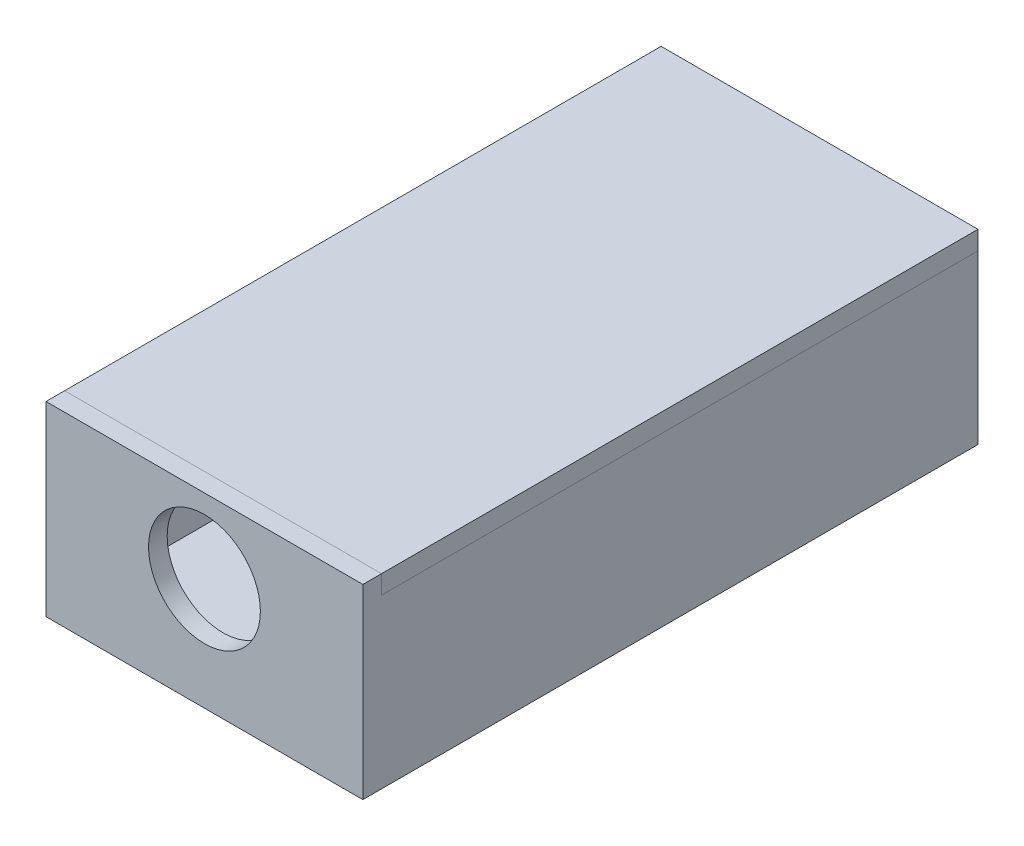
ISO-10303-21;
HEADER;
FILE_DESCRIPTION(('STEP AP214'),'2;1');
FILE_NAME('part.step','',(''),(''),'','','');
FILE_SCHEMA(('AUTOMOTIVE_DESIGN { 1 0 10303 214 1 1 1 1 }'));
ENDSEC;
DATA;
#1=APPLICATION_CONTEXT('core data for automotive mechanical design processes');
#2=APPLICATION_PROTOCOL_DEFINITION('international standard','automotive_design',2000,#1);
#3=PRODUCT_CONTEXT('',#1,'mechanical');
#4=PRODUCT('Part','Part','',(#3));
#5=PRODUCT_RELATED_PRODUCT_CATEGORY('part','',(#4));
#6=PRODUCT_DEFINITION_FORMATION('','',#4);
#7=PRODUCT_DEFINITION_CONTEXT('part definition',#1,'design');
#8=PRODUCT_DEFINITION('design','',#6,#7);
#9=PRODUCT_DEFINITION_SHAPE('','',#8);
#10=(LENGTH_UNIT() NAMED_UNIT(*) SI_UNIT(.MILLI.,.METRE.));
#11=(NAMED_UNIT(*) PLANE_ANGLE_UNIT() SI_UNIT($,.RADIAN.));
#12=(NAMED_UNIT(*) SI_UNIT($,.STERADIAN.) SOLID_ANGLE_UNIT());
#13=UNCERTAINTY_MEASURE_WITH_UNIT(LENGTH_MEASURE(1.E-05),#10,'distance_accuracy_value','');
#14=(GEOMETRIC_REPRESENTATION_CONTEXT(3) GLOBAL_UNCERTAINTY_ASSIGNED_CONTEXT((#13)) GLOBAL_UNIT_ASSIGNED_CONTEXT((#10,
#11,#12)) REPRESENTATION_CONTEXT('',''));
#15=CARTESIAN_POINT('',(0.,0.,0.));
#16=DIRECTION('',(0.,0.,1.));
#17=DIRECTION('',(1.,0.,0.));
#18=AXIS2_PLACEMENT_3D('',#15,#16,#17);
#19=CARTESIAN_POINT('',(-8.49999999999999,10.,-16.5));
#20=DIRECTION('',(1.,0.,0.));
#21=DIRECTION('',(0.,0.,-1.));
#22=AXIS2_PLACEMENT_3D('',#19,#20,#21);
#23=PLANE('',#22);
#24=DIRECTION('',(0.,0.,1.));
#25=VECTOR('',#24,1.);
#26=CARTESIAN_POINT('',(-8.49999999999999,9.,-16.5));
#27=LINE('',#26,#25);
#28=CARTESIAN_POINT('',(-8.49999999999999,9.,-16.5));
#29=VERTEX_POINT('',#28);
#30=CARTESIAN_POINT('',(-8.49999999999999,9.,15.5));
#31=VERTEX_POINT('',#30);
#32=EDGE_CURVE('E106',#29,#31,#27,.T.);
#33=ORIENTED_EDGE('',*,*,#32,.T.);
#34=DIRECTION('',(0.,-1.,0.));
#35=VECTOR('',#34,1.);
#36=CARTESIAN_POINT('',(-8.49999999999999,10.,15.5));
#37=LINE('',#36,#35);
#38=CARTESIAN_POINT('',(-8.49999999999999,10.,15.5));
#39=VERTEX_POINT('',#38);
#40=EDGE_CURVE('E12',#39,#31,#37,.T.);
#41=ORIENTED_EDGE('',*,*,#40,.F.);
#42=DIRECTION('',(0.,0.,1.));
#43=VECTOR('',#42,1.);
#44=CARTESIAN_POINT('',(-8.49999999999999,10.,-16.5));
#45=LINE('',#44,#43);
#46=CARTESIAN_POINT('',(-8.49999999999999,10.,-16.5));
#47=VERTEX_POINT('',#46);
#48=EDGE_CURVE('E94',#47,#39,#45,.T.);
#49=ORIENTED_EDGE('',*,*,#48,.F.);
#50=DIRECTION('',(0.,-1.,0.));
#51=VECTOR('',#50,1.);
#52=CARTESIAN_POINT('',(-8.49999999999999,10.,-16.5));
#53=LINE('',#52,#51);
#54=EDGE_CURVE('E102',#47,#29,#53,.T.);
#55=ORIENTED_EDGE('',*,*,#54,.T.);
#56=EDGE_LOOP('',(#33,#41,#49,#55));
#57=FACE_BOUND('',#56,.T.);
#58=ADVANCED_FACE('F43',(#57),#23,.F.);
#59=CARTESIAN_POINT('',(-8.49999999999999,10.,15.5));
#60=DIRECTION('',(0.,0.,-1.));
#61=DIRECTION('',(-1.,0.,0.));
#62=AXIS2_PLACEMENT_3D('',#59,#60,#61);
#63=PLANE('',#62);
#64=DIRECTION('',(1.,0.,0.));
#65=VECTOR('',#64,1.);
#66=CARTESIAN_POINT('',(-8.49999999999999,9.,15.5));
#67=LINE('',#66,#65);
#68=CARTESIAN_POINT('',(8.50000000000001,9.,15.5));
#69=VERTEX_POINT('',#68);
#70=EDGE_CURVE('E98',#31,#69,#67,.T.);
#71=ORIENTED_EDGE('',*,*,#70,.T.);
#72=DIRECTION('',(0.,-1.,0.));
#73=VECTOR('',#72,1.);
#74=CARTESIAN_POINT('',(8.50000000000001,10.,15.5));
#75=LINE('',#74,#73);
#76=CARTESIAN_POINT('',(8.50000000000001,10.,15.5));
#77=VERTEX_POINT('',#76);
#78=EDGE_CURVE('E51',#77,#69,#75,.T.);
#79=ORIENTED_EDGE('',*,*,#78,.F.);
#80=DIRECTION('',(1.,0.,0.));
#81=VECTOR('',#80,1.);
#82=CARTESIAN_POINT('',(-8.49999999999999,10.,15.5));
#83=LINE('',#82,#81);
#84=EDGE_CURVE('E89',#39,#77,#83,.T.);
#85=ORIENTED_EDGE('',*,*,#84,.F.);
#86=ORIENTED_EDGE('',*,*,#40,.T.);
#87=EDGE_LOOP('',(#71,#79,#85,#86));
#88=FACE_BOUND('',#87,.T.);
#89=ADVANCED_FACE('F97',(#88),#63,.F.);
#90=CARTESIAN_POINT('',(8.50000000000001,10.,-16.5));
#91=DIRECTION('',(-1.,0.,0.));
#92=DIRECTION('',(0.,0.,1.));
#93=AXIS2_PLACEMENT_3D('',#90,#91,#92);
#94=PLANE('',#93);
#95=DIRECTION('',(0.,0.,-1.));
#96=VECTOR('',#95,1.);
#97=CARTESIAN_POINT('',(8.50000000000001,9.,-16.5));
#98=LINE('',#97,#96);
#99=CARTESIAN_POINT('',(8.50000000000001,9.,-16.5));
#100=VERTEX_POINT('',#99);
#101=EDGE_CURVE('E76',#69,#100,#98,.T.);
#102=ORIENTED_EDGE('',*,*,#101,.T.);
#103=DIRECTION('',(0.,-1.,0.));
#104=VECTOR('',#103,1.);
#105=CARTESIAN_POINT('',(8.50000000000001,10.,-16.5));
#106=LINE('',#105,#104);
#107=CARTESIAN_POINT('',(8.50000000000001,10.,-16.5));
#108=VERTEX_POINT('',#107);
#109=EDGE_CURVE('E99',#108,#100,#106,.T.);
#110=ORIENTED_EDGE('',*,*,#109,.F.);
#111=DIRECTION('',(0.,0.,-1.));
#112=VECTOR('',#111,1.);
#113=CARTESIAN_POINT('',(8.50000000000001,10.,-16.5));
#114=LINE('',#113,#112);
#115=EDGE_CURVE('E92',#77,#108,#114,.T.);
#116=ORIENTED_EDGE('',*,*,#115,.F.);
#117=ORIENTED_EDGE('',*,*,#78,.T.);
#118=EDGE_LOOP('',(#102,#110,#116,#117));
#119=FACE_BOUND('',#118,.T.);
#120=ADVANCED_FACE('F100',(#119),#94,.F.);
#121=CARTESIAN_POINT('',(-8.49999999999999,10.,-16.5));
#122=DIRECTION('',(0.,0.,1.));
#123=DIRECTION('',(1.,0.,0.));
#124=AXIS2_PLACEMENT_3D('',#121,#122,#123);
#125=PLANE('',#124);
#126=DIRECTION('',(-1.,0.,0.));
#127=VECTOR('',#126,1.);
#128=CARTESIAN_POINT('',(-8.49999999999999,9.,-16.5));
#129=LINE('',#128,#127);
#130=EDGE_CURVE('E82',#100,#29,#129,.T.);
#131=ORIENTED_EDGE('',*,*,#130,.T.);
#132=ORIENTED_EDGE('',*,*,#54,.F.);
#133=DIRECTION('',(-1.,0.,0.));
#134=VECTOR('',#133,1.);
#135=CARTESIAN_POINT('',(-8.49999999999999,10.,-16.5));
#136=LINE('',#135,#134);
#137=EDGE_CURVE('E59',#108,#47,#136,.T.);
#138=ORIENTED_EDGE('',*,*,#137,.F.);
#139=ORIENTED_EDGE('',*,*,#109,.T.);
#140=EDGE_LOOP('',(#131,#132,#138,#139));
#141=FACE_BOUND('',#140,.T.);
#142=ADVANCED_FACE('F113',(#141),#125,.F.);
#143=CARTESIAN_POINT('',(0.,10.,0.));
#144=DIRECTION('',(0.,1.,0.));
#145=DIRECTION('',(0.,0.,1.));
#146=AXIS2_PLACEMENT_3D('',#143,#144,#145);
#147=PLANE('',#146);
#148=ORIENTED_EDGE('',*,*,#48,.T.);
#149=ORIENTED_EDGE('',*,*,#84,.T.);
#150=ORIENTED_EDGE('',*,*,#115,.T.);
#151=ORIENTED_EDGE('',*,*,#137,.T.);
#152=EDGE_LOOP('',(#148,#149,#150,#151));
#153=FACE_BOUND('',#152,.T.);
#154=ADVANCED_FACE('F90',(#153),#147,.T.);
#155=CARTESIAN_POINT('',(0.,9.,0.));
#156=DIRECTION('',(0.,1.,0.));
#157=DIRECTION('',(0.,0.,1.));
#158=AXIS2_PLACEMENT_3D('',#155,#156,#157);
#159=PLANE('',#158);
#160=ORIENTED_EDGE('',*,*,#32,.F.);
#161=ORIENTED_EDGE('',*,*,#130,.F.);
#162=ORIENTED_EDGE('',*,*,#101,.F.);
#163=ORIENTED_EDGE('',*,*,#70,.F.);
#164=EDGE_LOOP('',(#160,#161,#162,#163));
#165=FACE_BOUND('',#164,.T.);
#166=ADVANCED_FACE('F116',(#165),#159,.F.);
#167=CLOSED_SHELL('',(#58,#89,#120,#142,#154,#166));
#168=MANIFOLD_SOLID_BREP('B2',#167);
#169=CARTESIAN_POINT('',(-8.49999999999999,10.,16.5));
#170=DIRECTION('',(1.,0.,0.));
#171=DIRECTION('',(0.,0.,-1.));
#172=AXIS2_PLACEMENT_3D('',#169,#170,#171);
#173=PLANE('',#172);
#174=DIRECTION('',(0.,-1.,0.));
#175=VECTOR('',#174,1.);
#176=CARTESIAN_POINT('',(-8.49999999999999,17.,15.5));
#177=LINE('',#176,#175);
#178=CARTESIAN_POINT('',(-8.49999999999999,10.,15.5));
#179=VERTEX_POINT('',#178);
#180=CARTESIAN_POINT('',(-8.49999999999999,9.,15.5));
#181=VERTEX_POINT('',#180);
#182=EDGE_CURVE('E259',#179,#181,#177,.T.);
#183=ORIENTED_EDGE('',*,*,#182,.T.);
#184=DIRECTION('',(0.,0.,1.));
#185=VECTOR('',#184,1.);
#186=CARTESIAN_POINT('',(-8.49999999999999,9.,-16.5));
#187=LINE('',#186,#185);
#188=CARTESIAN_POINT('',(-8.49999999999999,9.,-16.5));
#189=VERTEX_POINT('',#188);
#190=EDGE_CURVE('E218',#189,#181,#187,.T.);
#191=ORIENTED_EDGE('',*,*,#190,.F.);
#192=DIRECTION('',(0.,-1.,0.));
#193=VECTOR('',#192,1.);
#194=CARTESIAN_POINT('',(-8.49999999999999,10.,-16.5));
#195=LINE('',#194,#193);
#196=CARTESIAN_POINT('',(-8.49999999999999,0.,-16.5));
#197=VERTEX_POINT('',#196);
#198=EDGE_CURVE('E210',#189,#197,#195,.T.);
#199=ORIENTED_EDGE('',*,*,#198,.T.);
#200=DIRECTION('',(0.,0.,1.));
#201=VECTOR('',#200,1.);
#202=CARTESIAN_POINT('',(-8.49999999999999,0.,16.5));
#203=LINE('',#202,#201);
#204=CARTESIAN_POINT('',(-8.49999999999999,0.,16.5));
#205=VERTEX_POINT('',#204);
#206=EDGE_CURVE('E215',#197,#205,#203,.T.);
#207=ORIENTED_EDGE('',*,*,#206,.T.);
#208=DIRECTION('',(0.,-1.,0.));
#209=VECTOR('',#208,1.);
#210=CARTESIAN_POINT('',(-8.49999999999999,10.,16.5));
#211=LINE('',#210,#209);
#212=CARTESIAN_POINT('',(-8.49999999999999,10.,16.5));
#213=VERTEX_POINT('',#212);
#214=EDGE_CURVE('E41',#213,#205,#211,.T.);
#215=ORIENTED_EDGE('',*,*,#214,.F.);
#216=DIRECTION('',(0.,0.,1.));
#217=VECTOR('',#216,1.);
#218=CARTESIAN_POINT('',(-8.49999999999999,10.,16.5));
#219=LINE('',#218,#217);
#220=EDGE_CURVE('E232',#179,#213,#219,.T.);
#221=ORIENTED_EDGE('',*,*,#220,.F.);
#222=EDGE_LOOP('',(#183,#191,#199,#207,#215,#221));
#223=FACE_BOUND('',#222,.T.);
#224=ADVANCED_FACE('F167',(#223),#173,.F.);
#225=CARTESIAN_POINT('',(8.50000000000001,10.,16.5));
#226=DIRECTION('',(-1.,0.,0.));
#227=DIRECTION('',(0.,0.,1.));
#228=AXIS2_PLACEMENT_3D('',#225,#226,#227);
#229=PLANE('',#228);
#230=DIRECTION('',(0.,-1.,0.));
#231=VECTOR('',#230,1.);
#232=CARTESIAN_POINT('',(8.50000000000001,17.,15.5));
#233=LINE('',#232,#231);
#234=CARTESIAN_POINT('',(8.50000000000001,10.,15.5));
#235=VERTEX_POINT('',#234);
#236=CARTESIAN_POINT('',(8.50000000000001,9.,15.5));
#237=VERTEX_POINT('',#236);
#238=EDGE_CURVE('E297',#235,#237,#233,.T.);
#239=ORIENTED_EDGE('',*,*,#238,.F.);
#240=DIRECTION('',(0.,0.,-1.));
#241=VECTOR('',#240,1.);
#242=CARTESIAN_POINT('',(8.50000000000001,10.,16.5));
#243=LINE('',#242,#241);
#244=CARTESIAN_POINT('',(8.50000000000001,10.,16.5));
#245=VERTEX_POINT('',#244);
#246=EDGE_CURVE('E222',#245,#235,#243,.T.);
#247=ORIENTED_EDGE('',*,*,#246,.F.);
#248=DIRECTION('',(0.,-1.,0.));
#249=VECTOR('',#248,1.);
#250=CARTESIAN_POINT('',(8.50000000000001,10.,16.5));
#251=LINE('',#250,#249);
#252=CARTESIAN_POINT('',(8.50000000000001,0.,16.5));
#253=VERTEX_POINT('',#252);
#254=EDGE_CURVE('E174',#245,#253,#251,.T.);
#255=ORIENTED_EDGE('',*,*,#254,.T.);
#256=DIRECTION('',(0.,0.,-1.));
#257=VECTOR('',#256,1.);
#258=CARTESIAN_POINT('',(8.50000000000001,0.,16.5));
#259=LINE('',#258,#257);
#260=CARTESIAN_POINT('',(8.50000000000001,0.,-16.5));
#261=VERTEX_POINT('',#260);
#262=EDGE_CURVE('E233',#253,#261,#259,.T.);
#263=ORIENTED_EDGE('',*,*,#262,.T.);
#264=DIRECTION('',(0.,-1.,0.));
#265=VECTOR('',#264,1.);
#266=CARTESIAN_POINT('',(8.50000000000001,10.,-16.5));
#267=LINE('',#266,#265);
#268=CARTESIAN_POINT('',(8.50000000000001,9.,-16.5));
#269=VERTEX_POINT('',#268);
#270=EDGE_CURVE('E221',#269,#261,#267,.T.);
#271=ORIENTED_EDGE('',*,*,#270,.F.);
#272=DIRECTION('',(0.,0.,-1.));
#273=VECTOR('',#272,1.);
#274=CARTESIAN_POINT('',(8.50000000000001,9.,-16.5));
#275=LINE('',#274,#273);
#276=EDGE_CURVE('E304',#237,#269,#275,.T.);
#277=ORIENTED_EDGE('',*,*,#276,.F.);
#278=EDGE_LOOP('',(#239,#247,#255,#263,#271,#277));
#279=FACE_BOUND('',#278,.T.);
#280=ADVANCED_FACE('F251',(#279),#229,.F.);
#281=CARTESIAN_POINT('',(8.50000000000001,10.,-16.5));
#282=DIRECTION('',(0.,0.,1.));
#283=DIRECTION('',(1.,0.,0.));
#284=AXIS2_PLACEMENT_3D('',#281,#282,#283);
#285=PLANE('',#284);
#286=DIRECTION('',(-1.,0.,0.));
#287=VECTOR('',#286,1.);
#288=CARTESIAN_POINT('',(-8.49999999999999,9.,-16.5));
#289=LINE('',#288,#287);
#290=CARTESIAN_POINT('',(7.50000000000001,9.,-16.5));
#291=VERTEX_POINT('',#290);
#292=EDGE_CURVE('E300',#269,#291,#289,.T.);
#293=ORIENTED_EDGE('',*,*,#292,.F.);
#294=ORIENTED_EDGE('',*,*,#270,.T.);
#295=DIRECTION('',(-1.,0.,0.));
#296=VECTOR('',#295,1.);
#297=CARTESIAN_POINT('',(8.50000000000001,0.,-16.5));
#298=LINE('',#297,#296);
#299=EDGE_CURVE('E225',#261,#197,#298,.T.);
#300=ORIENTED_EDGE('',*,*,#299,.T.);
#301=ORIENTED_EDGE('',*,*,#198,.F.);
#302=CARTESIAN_POINT('',(-7.5,9.,-16.5));
#303=VERTEX_POINT('',#302);
#304=EDGE_CURVE('E303',#303,#189,#289,.T.);
#305=ORIENTED_EDGE('',*,*,#304,.F.);
#306=DIRECTION('',(0.,-1.,0.));
#307=VECTOR('',#306,1.);
#308=CARTESIAN_POINT('',(-7.5,9.,-16.5));
#309=LINE('',#308,#307);
#310=CARTESIAN_POINT('',(-7.5,1.,-16.5));
#311=VERTEX_POINT('',#310);
#312=EDGE_CURVE('E269',#303,#311,#309,.T.);
#313=ORIENTED_EDGE('',*,*,#312,.T.);
#314=DIRECTION('',(-1.,0.,0.));
#315=VECTOR('',#314,1.);
#316=CARTESIAN_POINT('',(-7.5,1.,-16.5));
#317=LINE('',#316,#315);
#318=CARTESIAN_POINT('',(7.50000000000001,0.999999999999999,-16.5));
#319=VERTEX_POINT('',#318);
#320=EDGE_CURVE('E273',#319,#311,#317,.T.);
#321=ORIENTED_EDGE('',*,*,#320,.F.);
#322=DIRECTION('',(0.,-1.,0.));
#323=VECTOR('',#322,1.);
#324=CARTESIAN_POINT('',(7.50000000000001,9.,-16.5));
#325=LINE('',#324,#323);
#326=EDGE_CURVE('E181',#291,#319,#325,.T.);
#327=ORIENTED_EDGE('',*,*,#326,.F.);
#328=EDGE_LOOP('',(#293,#294,#300,#301,#305,#313,#321,#327));
#329=FACE_BOUND('',#328,.T.);
#330=ADVANCED_FACE('F227',(#329),#285,.F.);
#331=CARTESIAN_POINT('',(0.,10.,0.));
#332=DIRECTION('',(0.,1.,0.));
#333=DIRECTION('',(0.,0.,1.));
#334=AXIS2_PLACEMENT_3D('',#331,#332,#333);
#335=PLANE('',#334);
#336=ORIENTED_EDGE('',*,*,#246,.T.);
#337=DIRECTION('',(-1.,0.,0.));
#338=VECTOR('',#337,1.);
#339=CARTESIAN_POINT('',(0.,10.,15.5));
#340=LINE('',#339,#338);
#341=EDGE_CURVE('E294',#235,#179,#340,.T.);
#342=ORIENTED_EDGE('',*,*,#341,.T.);
#343=ORIENTED_EDGE('',*,*,#220,.T.);
#344=DIRECTION('',(1.,0.,0.));
#345=VECTOR('',#344,1.);
#346=CARTESIAN_POINT('',(8.50000000000001,10.,16.5));
#347=LINE('',#346,#345);
#348=EDGE_CURVE('E190',#213,#245,#347,.T.);
#349=ORIENTED_EDGE('',*,*,#348,.T.);
#350=EDGE_LOOP('',(#336,#342,#343,#349));
#351=FACE_BOUND('',#350,.T.);
#352=ADVANCED_FACE('F373',(#351),#335,.T.);
#353=CARTESIAN_POINT('',(8.50000000000001,10.,16.5));
#354=DIRECTION('',(0.,0.,-1.));
#355=DIRECTION('',(-1.,0.,0.));
#356=AXIS2_PLACEMENT_3D('',#353,#354,#355);
#357=PLANE('',#356);
#358=DIRECTION('',(1.,0.,0.));
#359=VECTOR('',#358,1.);
#360=CARTESIAN_POINT('',(8.50000000000001,0.,16.5));
#361=LINE('',#360,#359);
#362=EDGE_CURVE('E236',#205,#253,#361,.T.);
#363=ORIENTED_EDGE('',*,*,#362,.T.);
#364=ORIENTED_EDGE('',*,*,#254,.F.);
#365=ORIENTED_EDGE('',*,*,#348,.F.);
#366=ORIENTED_EDGE('',*,*,#214,.T.);
#367=EDGE_LOOP('',(#363,#364,#365,#366));
#368=FACE_BOUND('',#367,.T.);
#369=CARTESIAN_POINT('',(0.,6.,16.5));
#370=DIRECTION('',(0.,0.,1.));
#371=DIRECTION('',(1.,0.,0.));
#372=AXIS2_PLACEMENT_3D('',#369,#370,#371);
#373=CIRCLE('',#372,3.);
#374=CARTESIAN_POINT('',(3.,6.,16.5));
#375=VERTEX_POINT('',#374);
#376=EDGE_CURVE('E291',#375,#375,#373,.T.);
#377=ORIENTED_EDGE('',*,*,#376,.F.);
#378=EDGE_LOOP('',(#377));
#379=FACE_BOUND('',#378,.T.);
#380=ADVANCED_FACE('F253',(#368,#379),#357,.F.);
#381=CARTESIAN_POINT('',(-7.49999999999999,9.,15.5));
#382=DIRECTION('',(0.,0.,-1.));
#383=DIRECTION('',(-1.,0.,0.));
#384=AXIS2_PLACEMENT_3D('',#381,#382,#383);
#385=PLANE('',#384);
#386=DIRECTION('',(1.,0.,0.));
#387=VECTOR('',#386,1.);
#388=CARTESIAN_POINT('',(-8.49999999999999,9.,15.5));
#389=LINE('',#388,#387);
#390=CARTESIAN_POINT('',(7.50000000000001,9.,15.5));
#391=VERTEX_POINT('',#390);
#392=EDGE_CURVE('E310',#391,#237,#389,.T.);
#393=ORIENTED_EDGE('',*,*,#392,.F.);
#394=DIRECTION('',(0.,-1.,0.));
#395=VECTOR('',#394,1.);
#396=CARTESIAN_POINT('',(7.50000000000001,9.,15.5));
#397=LINE('',#396,#395);
#398=CARTESIAN_POINT('',(7.50000000000001,1.,15.5));
#399=VERTEX_POINT('',#398);
#400=EDGE_CURVE('E241',#391,#399,#397,.T.);
#401=ORIENTED_EDGE('',*,*,#400,.T.);
#402=DIRECTION('',(1.,0.,0.));
#403=VECTOR('',#402,1.);
#404=CARTESIAN_POINT('',(-7.49999999999999,1.,15.5));
#405=LINE('',#404,#403);
#406=CARTESIAN_POINT('',(-7.49999999999999,1.,15.5));
#407=VERTEX_POINT('',#406);
#408=EDGE_CURVE('E279',#407,#399,#405,.T.);
#409=ORIENTED_EDGE('',*,*,#408,.F.);
#410=DIRECTION('',(0.,-1.,0.));
#411=VECTOR('',#410,1.);
#412=CARTESIAN_POINT('',(-7.49999999999999,9.,15.5));
#413=LINE('',#412,#411);
#414=CARTESIAN_POINT('',(-7.5,9.,15.5));
#415=VERTEX_POINT('',#414);
#416=EDGE_CURVE('E237',#415,#407,#413,.T.);
#417=ORIENTED_EDGE('',*,*,#416,.F.);
#418=EDGE_CURVE('E307',#181,#415,#389,.T.);
#419=ORIENTED_EDGE('',*,*,#418,.F.);
#420=ORIENTED_EDGE('',*,*,#182,.F.);
#421=ORIENTED_EDGE('',*,*,#341,.F.);
#422=ORIENTED_EDGE('',*,*,#238,.T.);
#423=EDGE_LOOP('',(#393,#401,#409,#417,#419,#420,#421,#422));
#424=FACE_BOUND('',#423,.T.);
#425=CARTESIAN_POINT('',(0.,6.,15.5));
#426=DIRECTION('',(0.,0.,-1.));
#427=DIRECTION('',(-1.,0.,0.));
#428=AXIS2_PLACEMENT_3D('',#425,#426,#427);
#429=CIRCLE('',#428,3.);
#430=CARTESIAN_POINT('',(-3.,6.,15.5));
#431=VERTEX_POINT('',#430);
#432=EDGE_CURVE('E285',#431,#431,#429,.F.);
#433=ORIENTED_EDGE('',*,*,#432,.T.);
#434=EDGE_LOOP('',(#433));
#435=FACE_BOUND('',#434,.T.);
#436=ADVANCED_FACE('F352',(#424,#435),#385,.T.);
#437=CARTESIAN_POINT('',(0.,0.,0.));
#438=DIRECTION('',(0.,1.,0.));
#439=DIRECTION('',(0.,0.,1.));
#440=AXIS2_PLACEMENT_3D('',#437,#438,#439);
#441=PLANE('',#440);
#442=ORIENTED_EDGE('',*,*,#206,.F.);
#443=ORIENTED_EDGE('',*,*,#299,.F.);
#444=ORIENTED_EDGE('',*,*,#262,.F.);
#445=ORIENTED_EDGE('',*,*,#362,.F.);
#446=EDGE_LOOP('',(#442,#443,#444,#445));
#447=FACE_BOUND('',#446,.T.);
#448=ADVANCED_FACE('F235',(#447),#441,.F.);
#449=CARTESIAN_POINT('',(-7.5,9.,-16.5));
#450=DIRECTION('',(1.,0.,0.));
#451=DIRECTION('',(0.,0.,-1.));
#452=AXIS2_PLACEMENT_3D('',#449,#450,#451);
#453=PLANE('',#452);
#454=DIRECTION('',(0.,0.,1.));
#455=VECTOR('',#454,1.);
#456=CARTESIAN_POINT('',(-7.5,1.,-16.5));
#457=LINE('',#456,#455);
#458=EDGE_CURVE('E282',#311,#407,#457,.T.);
#459=ORIENTED_EDGE('',*,*,#458,.F.);
#460=ORIENTED_EDGE('',*,*,#312,.F.);
#461=DIRECTION('',(0.,0.,1.));
#462=VECTOR('',#461,1.);
#463=CARTESIAN_POINT('',(-7.5,9.,-16.5));
#464=LINE('',#463,#462);
#465=EDGE_CURVE('E276',#303,#415,#464,.T.);
#466=ORIENTED_EDGE('',*,*,#465,.T.);
#467=ORIENTED_EDGE('',*,*,#416,.T.);
#468=EDGE_LOOP('',(#459,#460,#466,#467));
#469=FACE_BOUND('',#468,.T.);
#470=ADVANCED_FACE('F348',(#469),#453,.T.);
#471=CARTESIAN_POINT('',(7.50000000000001,9.,-16.5));
#472=DIRECTION('',(-1.,0.,0.));
#473=DIRECTION('',(0.,0.,1.));
#474=AXIS2_PLACEMENT_3D('',#471,#472,#473);
#475=PLANE('',#474);
#476=DIRECTION('',(0.,0.,-1.));
#477=VECTOR('',#476,1.);
#478=CARTESIAN_POINT('',(7.50000000000001,1.,-16.5));
#479=LINE('',#478,#477);
#480=EDGE_CURVE('E277',#399,#319,#479,.T.);
#481=ORIENTED_EDGE('',*,*,#480,.F.);
#482=ORIENTED_EDGE('',*,*,#400,.F.);
#483=DIRECTION('',(0.,0.,-1.));
#484=VECTOR('',#483,1.);
#485=CARTESIAN_POINT('',(7.50000000000001,9.,-16.5));
#486=LINE('',#485,#484);
#487=EDGE_CURVE('E272',#391,#291,#486,.T.);
#488=ORIENTED_EDGE('',*,*,#487,.T.);
#489=ORIENTED_EDGE('',*,*,#326,.T.);
#490=EDGE_LOOP('',(#481,#482,#488,#489));
#491=FACE_BOUND('',#490,.T.);
#492=ADVANCED_FACE('F354',(#491),#475,.T.);
#493=CARTESIAN_POINT('',(0.,1.,0.));
#494=DIRECTION('',(0.,1.,0.));
#495=DIRECTION('',(0.,0.,1.));
#496=AXIS2_PLACEMENT_3D('',#493,#494,#495);
#497=PLANE('',#496);
#498=ORIENTED_EDGE('',*,*,#458,.T.);
#499=ORIENTED_EDGE('',*,*,#408,.T.);
#500=ORIENTED_EDGE('',*,*,#480,.T.);
#501=ORIENTED_EDGE('',*,*,#320,.T.);
#502=EDGE_LOOP('',(#498,#499,#500,#501));
#503=FACE_BOUND('',#502,.T.);
#504=ADVANCED_FACE('F345',(#503),#497,.T.);
#505=CARTESIAN_POINT('',(0.,6.,16.5));
#506=DIRECTION('',(0.,0.,-1.));
#507=DIRECTION('',(-1.,0.,0.));
#508=AXIS2_PLACEMENT_3D('',#505,#506,#507);
#509=CYLINDRICAL_SURFACE('',#508,3.);
#510=ORIENTED_EDGE('',*,*,#432,.F.);
#511=EDGE_LOOP('',(#510));
#512=FACE_BOUND('',#511,.T.);
#513=ORIENTED_EDGE('',*,*,#376,.T.);
#514=EDGE_LOOP('',(#513));
#515=FACE_BOUND('',#514,.T.);
#516=ADVANCED_FACE('F361',(#512,#515),#509,.F.);
#517=CARTESIAN_POINT('',(0.,9.,0.));
#518=DIRECTION('',(0.,1.,0.));
#519=DIRECTION('',(0.,0.,1.));
#520=AXIS2_PLACEMENT_3D('',#517,#518,#519);
#521=PLANE('',#520);
#522=ORIENTED_EDGE('',*,*,#304,.T.);
#523=ORIENTED_EDGE('',*,*,#190,.T.);
#524=ORIENTED_EDGE('',*,*,#418,.T.);
#525=ORIENTED_EDGE('',*,*,#465,.F.);
#526=EDGE_LOOP('',(#522,#523,#524,#525));
#527=FACE_BOUND('',#526,.T.);
#528=ADVANCED_FACE('F350',(#527),#521,.T.);
#529=ORIENTED_EDGE('',*,*,#392,.T.);
#530=ORIENTED_EDGE('',*,*,#276,.T.);
#531=ORIENTED_EDGE('',*,*,#292,.T.);
#532=ORIENTED_EDGE('',*,*,#487,.F.);
#533=EDGE_LOOP('',(#529,#530,#531,#532));
#534=FACE_BOUND('',#533,.T.);
#535=ADVANCED_FACE('F319',(#534),#521,.T.);
#536=CLOSED_SHELL('',(#224,#280,#330,#352,#380,#436,#448,#470,#492,#504,#516,#528,#535));
#537=MANIFOLD_SOLID_BREP('B6',#536);
#538=ADVANCED_BREP_SHAPE_REPRESENTATION('',(#18,#168,#537),#14);
#539=SHAPE_DEFINITION_REPRESENTATION(#9,#538);
ENDSEC;
END-ISO-10303-21;
